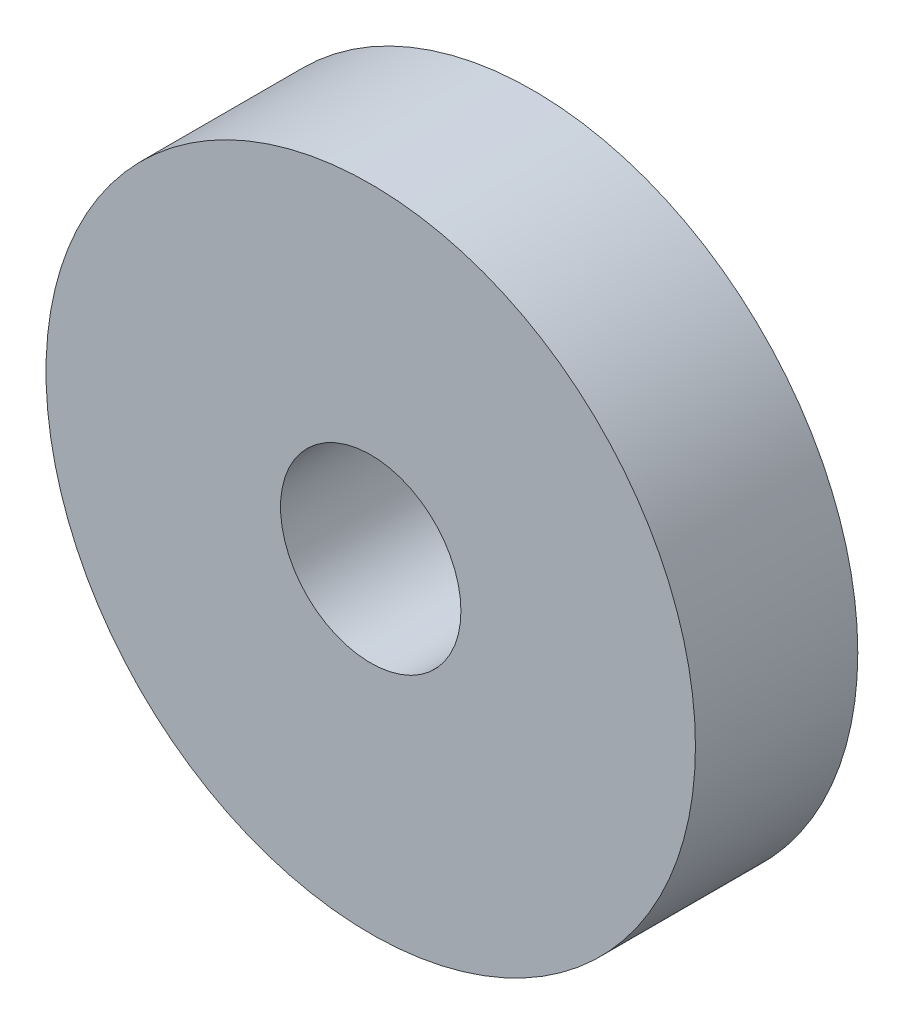
ISO-10303-21;
HEADER;
FILE_DESCRIPTION(('STEP AP214'),'2;1');
FILE_NAME('part.step','',(''),(''),'','','');
FILE_SCHEMA(('AUTOMOTIVE_DESIGN { 1 0 10303 214 1 1 1 1 }'));
ENDSEC;
DATA;
#1=APPLICATION_CONTEXT('core data for automotive mechanical design processes');
#2=APPLICATION_PROTOCOL_DEFINITION('international standard','automotive_design',2000,#1);
#3=PRODUCT_CONTEXT('',#1,'mechanical');
#4=PRODUCT('Part','Part','',(#3));
#5=PRODUCT_RELATED_PRODUCT_CATEGORY('part','',(#4));
#6=PRODUCT_DEFINITION_FORMATION('','',#4);
#7=PRODUCT_DEFINITION_CONTEXT('part definition',#1,'design');
#8=PRODUCT_DEFINITION('design','',#6,#7);
#9=PRODUCT_DEFINITION_SHAPE('','',#8);
#10=(LENGTH_UNIT() NAMED_UNIT(*) SI_UNIT(.MILLI.,.METRE.));
#11=(NAMED_UNIT(*) PLANE_ANGLE_UNIT() SI_UNIT($,.RADIAN.));
#12=(NAMED_UNIT(*) SI_UNIT($,.STERADIAN.) SOLID_ANGLE_UNIT());
#13=UNCERTAINTY_MEASURE_WITH_UNIT(LENGTH_MEASURE(1.E-05),#10,'distance_accuracy_value','');
#14=(GEOMETRIC_REPRESENTATION_CONTEXT(3) GLOBAL_UNCERTAINTY_ASSIGNED_CONTEXT((#13)) GLOBAL_UNIT_ASSIGNED_CONTEXT((#10,
#11,#12)) REPRESENTATION_CONTEXT('',''));
#15=CARTESIAN_POINT('',(0.,0.,0.));
#16=DIRECTION('',(0.,0.,1.));
#17=DIRECTION('',(1.,0.,0.));
#18=AXIS2_PLACEMENT_3D('',#15,#16,#17);
#19=CARTESIAN_POINT('',(0.,0.,9.));
#20=DIRECTION('',(0.,0.,1.));
#21=DIRECTION('',(1.,0.,0.));
#22=AXIS2_PLACEMENT_3D('',#19,#20,#21);
#23=PLANE('',#22);
#24=CARTESIAN_POINT('',(0.,0.,9.));
#25=DIRECTION('',(0.,0.,1.));
#26=DIRECTION('',(1.,0.,0.));
#27=AXIS2_PLACEMENT_3D('',#24,#25,#26);
#28=CIRCLE('',#27,18.);
#29=CARTESIAN_POINT('',(18.,0.,9.));
#30=VERTEX_POINT('',#29);
#31=EDGE_CURVE('E10',#30,#30,#28,.T.);
#32=ORIENTED_EDGE('',*,*,#31,.T.);
#33=EDGE_LOOP('',(#32));
#34=FACE_BOUND('',#33,.T.);
#35=CARTESIAN_POINT('',(0.,0.,9.));
#36=DIRECTION('',(0.,0.,1.));
#37=DIRECTION('',(1.,0.,0.));
#38=AXIS2_PLACEMENT_3D('',#35,#36,#37);
#39=CIRCLE('',#38,5.);
#40=CARTESIAN_POINT('',(5.,0.,9.));
#41=VERTEX_POINT('',#40);
#42=EDGE_CURVE('E44',#41,#41,#39,.T.);
#43=ORIENTED_EDGE('',*,*,#42,.F.);
#44=EDGE_LOOP('',(#43));
#45=FACE_BOUND('',#44,.T.);
#46=ADVANCED_FACE('F33',(#34,#45),#23,.T.);
#47=CARTESIAN_POINT('',(0.,0.,0.));
#48=DIRECTION('',(0.,0.,1.));
#49=DIRECTION('',(1.,0.,0.));
#50=AXIS2_PLACEMENT_3D('',#47,#48,#49);
#51=PLANE('',#50);
#52=CARTESIAN_POINT('',(0.,0.,0.));
#53=DIRECTION('',(0.,0.,1.));
#54=DIRECTION('',(1.,0.,0.));
#55=AXIS2_PLACEMENT_3D('',#52,#53,#54);
#56=CIRCLE('',#55,18.);
#57=CARTESIAN_POINT('',(18.,0.,0.));
#58=VERTEX_POINT('',#57);
#59=EDGE_CURVE('E40',#58,#58,#56,.T.);
#60=ORIENTED_EDGE('',*,*,#59,.F.);
#61=EDGE_LOOP('',(#60));
#62=FACE_BOUND('',#61,.T.);
#63=CARTESIAN_POINT('',(0.,0.,0.));
#64=DIRECTION('',(0.,0.,1.));
#65=DIRECTION('',(1.,0.,0.));
#66=AXIS2_PLACEMENT_3D('',#63,#64,#65);
#67=CIRCLE('',#66,5.);
#68=CARTESIAN_POINT('',(5.,0.,0.));
#69=VERTEX_POINT('',#68);
#70=EDGE_CURVE('E48',#69,#69,#67,.T.);
#71=ORIENTED_EDGE('',*,*,#70,.T.);
#72=EDGE_LOOP('',(#71));
#73=FACE_BOUND('',#72,.T.);
#74=ADVANCED_FACE('F54',(#62,#73),#51,.F.);
#75=CARTESIAN_POINT('',(0.,0.,9.));
#76=DIRECTION('',(0.,0.,-1.));
#77=DIRECTION('',(-1.,0.,0.));
#78=AXIS2_PLACEMENT_3D('',#75,#76,#77);
#79=CYLINDRICAL_SURFACE('',#78,18.);
#80=ORIENTED_EDGE('',*,*,#31,.F.);
#81=EDGE_LOOP('',(#80));
#82=FACE_BOUND('',#81,.T.);
#83=ORIENTED_EDGE('',*,*,#59,.T.);
#84=EDGE_LOOP('',(#83));
#85=FACE_BOUND('',#84,.T.);
#86=ADVANCED_FACE('F35',(#82,#85),#79,.T.);
#87=CARTESIAN_POINT('',(0.,0.,9.));
#88=DIRECTION('',(0.,0.,-1.));
#89=DIRECTION('',(-1.,0.,0.));
#90=AXIS2_PLACEMENT_3D('',#87,#88,#89);
#91=CYLINDRICAL_SURFACE('',#90,5.);
#92=ORIENTED_EDGE('',*,*,#42,.T.);
#93=EDGE_LOOP('',(#92));
#94=FACE_BOUND('',#93,.T.);
#95=ORIENTED_EDGE('',*,*,#70,.F.);
#96=EDGE_LOOP('',(#95));
#97=FACE_BOUND('',#96,.T.);
#98=ADVANCED_FACE('F56',(#94,#97),#91,.F.);
#99=CLOSED_SHELL('',(#46,#74,#86,#98));
#100=MANIFOLD_SOLID_BREP('B2',#99);
#101=ADVANCED_BREP_SHAPE_REPRESENTATION('',(#18,#100),#14);
#102=SHAPE_DEFINITION_REPRESENTATION(#9,#101);
ENDSEC;
END-ISO-10303-21;
